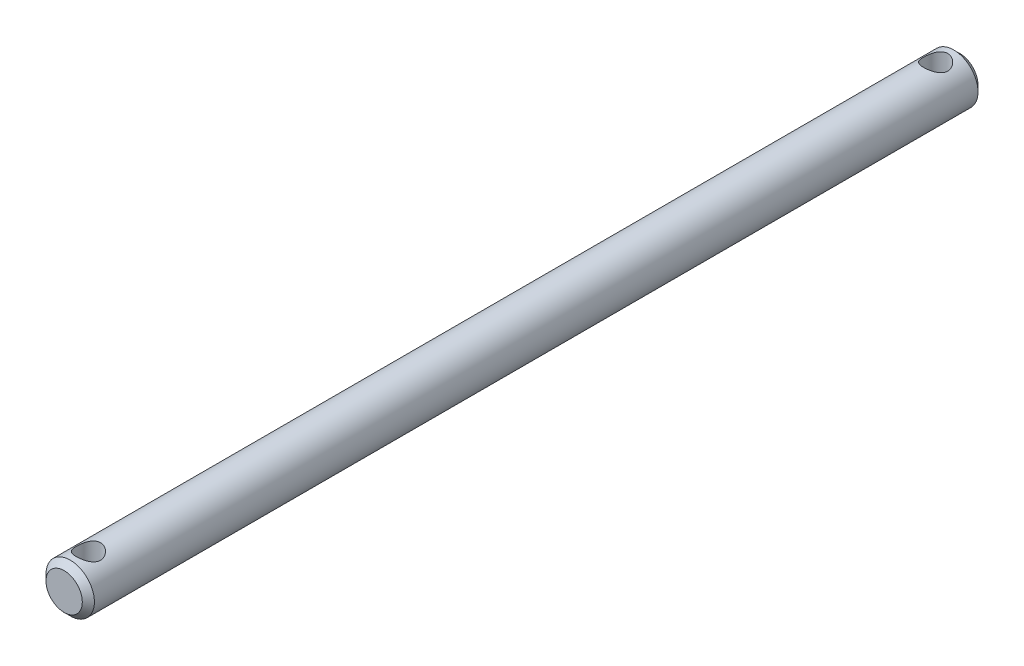
ISO-10303-21;
HEADER;
FILE_DESCRIPTION(('STEP AP214'),'2;1');
FILE_NAME('part.step','',(''),(''),'','','');
FILE_SCHEMA(('AUTOMOTIVE_DESIGN { 1 0 10303 214 1 1 1 1 }'));
ENDSEC;
DATA;
#1=APPLICATION_CONTEXT('core data for automotive mechanical design processes');
#2=APPLICATION_PROTOCOL_DEFINITION('international standard','automotive_design',2000,#1);
#3=PRODUCT_CONTEXT('',#1,'mechanical');
#4=PRODUCT('Part','Part','',(#3));
#5=PRODUCT_RELATED_PRODUCT_CATEGORY('part','',(#4));
#6=PRODUCT_DEFINITION_FORMATION('','',#4);
#7=PRODUCT_DEFINITION_CONTEXT('part definition',#1,'design');
#8=PRODUCT_DEFINITION('design','',#6,#7);
#9=PRODUCT_DEFINITION_SHAPE('','',#8);
#10=(LENGTH_UNIT() NAMED_UNIT(*) SI_UNIT(.MILLI.,.METRE.));
#11=(NAMED_UNIT(*) PLANE_ANGLE_UNIT() SI_UNIT($,.RADIAN.));
#12=(NAMED_UNIT(*) SI_UNIT($,.STERADIAN.) SOLID_ANGLE_UNIT());
#13=UNCERTAINTY_MEASURE_WITH_UNIT(LENGTH_MEASURE(1.E-05),#10,'distance_accuracy_value','');
#14=(GEOMETRIC_REPRESENTATION_CONTEXT(3) GLOBAL_UNCERTAINTY_ASSIGNED_CONTEXT((#13)) GLOBAL_UNIT_ASSIGNED_CONTEXT((#10,
#11,#12)) REPRESENTATION_CONTEXT('',''));
#15=CARTESIAN_POINT('',(0.,0.,0.));
#16=DIRECTION('',(0.,0.,1.));
#17=DIRECTION('',(1.,0.,0.));
#18=AXIS2_PLACEMENT_3D('',#15,#16,#17);
#19=CARTESIAN_POINT('',(0.,0.,74.));
#20=DIRECTION('',(0.,0.,-1.));
#21=DIRECTION('',(-1.,0.,0.));
#22=AXIS2_PLACEMENT_3D('',#19,#20,#21);
#23=CYLINDRICAL_SURFACE('',#22,2.);
#24=CARTESIAN_POINT('',(0.,-2.,3.));
#25=CARTESIAN_POINT('',(0.0525719629529865,-1.99999713404151,2.9999966976805));
#26=CARTESIAN_POINT('',(0.105206599698033,-1.99790491019518,2.99582992687833));
#27=CARTESIAN_POINT('',(0.208920235268425,-1.98974156037396,2.97934711965908));
#28=CARTESIAN_POINT('',(0.259996086713504,-1.98366287828984,2.96701560700235));
#29=CARTESIAN_POINT('',(0.358933544880574,-1.96816279403312,2.93480619138321));
#30=CARTESIAN_POINT('',(0.40680680293918,-1.9587543917752,2.91495761575199));
#31=CARTESIAN_POINT('',(0.498472616806565,-1.93745776515779,2.86842937863506));
#32=CARTESIAN_POINT('',(0.54226549399005,-1.9255697363353,2.84175025575115));
#33=CARTESIAN_POINT('',(0.627507817761919,-1.89956258258057,2.7804827505147));
#34=CARTESIAN_POINT('',(0.668655211122112,-1.88535199127536,2.74551352076036));
#35=CARTESIAN_POINT('',(0.744779444866977,-1.85659970246744,2.66947852075297));
#36=CARTESIAN_POINT('',(0.779751583106766,-1.84205776209035,2.62840814822756));
#37=CARTESIAN_POINT('',(0.845252000450279,-1.81298951197347,2.53751665047662));
#38=CARTESIAN_POINT('',(0.875225335551637,-1.79855186970132,2.48726390165409));
#39=CARTESIAN_POINT('',(0.926168226890695,-1.77285978772321,2.38163266401379));
#40=CARTESIAN_POINT('',(0.947144214966334,-1.7616030760699,2.32625787127725));
#41=CARTESIAN_POINT('',(0.978132442188588,-1.74457867037809,2.21533489457808));
#42=CARTESIAN_POINT('',(0.988725857080441,-1.73852271583714,2.15999554793261));
#43=CARTESIAN_POINT('',(1.00042699330885,-1.73181889948528,2.04802116222052));
#44=CARTESIAN_POINT('',(1.00154408837307,-1.73116569343288,1.99138745912885));
#45=CARTESIAN_POINT('',(0.994687287172294,-1.73510930257248,1.88571397568463));
#46=CARTESIAN_POINT('',(0.987784559536822,-1.73908763662013,1.83657596877695));
#47=CARTESIAN_POINT('',(0.966939849056932,-1.7507622873385,1.74027809062696));
#48=CARTESIAN_POINT('',(0.952995623897652,-1.75845978831776,1.69311885469469));
#49=CARTESIAN_POINT('',(0.918209780386004,-1.77687476412741,1.60077086743434));
#50=CARTESIAN_POINT('',(0.897215067115995,-1.78765840663999,1.55565360121421));
#51=CARTESIAN_POINT('',(0.849041687668002,-1.81103404281404,1.46936570740999));
#52=CARTESIAN_POINT('',(0.821860243812467,-1.82362684780191,1.42819686439991));
#53=CARTESIAN_POINT('',(0.758066054912788,-1.85113157903286,1.34547874725678));
#54=CARTESIAN_POINT('',(0.720694458369282,-1.86613510236746,1.30454312642384));
#55=CARTESIAN_POINT('',(0.639555578741373,-1.89547623300407,1.2292645814091));
#56=CARTESIAN_POINT('',(0.595785256574285,-1.90981351958801,1.19492480796612));
#57=CARTESIAN_POINT('',(0.500516505831848,-1.93701987282964,1.13231433897027));
#58=CARTESIAN_POINT('',(0.448753591599408,-1.94978984162007,1.10439952755426));
#59=CARTESIAN_POINT('',(0.340466215488797,-1.97157881121242,1.05790297095699));
#60=CARTESIAN_POINT('',(0.283945576265276,-1.98060078943553,1.03931381498483));
#61=CARTESIAN_POINT('',(0.172766491660701,-1.99324333741436,1.01352459628333));
#62=CARTESIAN_POINT('',(0.118341530548324,-1.99724938301312,1.00550876425322));
#63=CARTESIAN_POINT('',(0.00877959994935318,-2.00073013459102,0.998535268865512));
#64=CARTESIAN_POINT('',(-0.0463570198699018,-2.00020698721312,0.999573314360523));
#65=CARTESIAN_POINT('',(-0.151232971985994,-1.99491192253441,1.01020668841876));
#66=CARTESIAN_POINT('',(-0.201059408049955,-1.9904724568819,1.01913253273003));
#67=CARTESIAN_POINT('',(-0.298406892301917,-1.97822171314819,1.04423807189509));
#68=CARTESIAN_POINT('',(-0.345927685690997,-1.97041006334332,1.06041856645336));
#69=CARTESIAN_POINT('',(-0.438888608449666,-1.95184251413669,1.09999846643317));
#70=CARTESIAN_POINT('',(-0.484230397006154,-1.94100881769939,1.12359105011681));
#71=CARTESIAN_POINT('',(-0.570461361698921,-1.91743974317109,1.17710753564604));
#72=CARTESIAN_POINT('',(-0.611348629775282,-1.90470355565785,1.20703413459343));
#73=CARTESIAN_POINT('',(-0.691767689290653,-1.87708221337464,1.27576042533288));
#74=CARTESIAN_POINT('',(-0.730772077824639,-1.86210884848441,1.31514286845357));
#75=CARTESIAN_POINT('',(-0.80185632111324,-1.83262391603874,1.39992515126931));
#76=CARTESIAN_POINT('',(-0.833931385690841,-1.81811267381526,1.44532911881638));
#77=CARTESIAN_POINT('',(-0.891707914497696,-1.79051192226068,1.54364365420031));
#78=CARTESIAN_POINT('',(-0.917025495878637,-1.77752529663472,1.5968112662086));
#79=CARTESIAN_POINT('',(-0.958082826013803,-1.75574072368126,1.70751006769252));
#80=CARTESIAN_POINT('',(-0.97383491588757,-1.74693738240618,1.76503552650119));
#81=CARTESIAN_POINT('',(-0.993861687449679,-1.73561501008667,1.87691022286145));
#82=CARTESIAN_POINT('',(-0.999092996400865,-1.73257383460491,1.93103425342904));
#83=CARTESIAN_POINT('',(-1.00068915438079,-1.73165354646175,2.03944706717073));
#84=CARTESIAN_POINT('',(-0.997057846624399,-1.73377219627553,2.09373576873944));
#85=CARTESIAN_POINT('',(-0.981926125592263,-1.74237862050025,2.19548350153202));
#86=CARTESIAN_POINT('',(-0.971208314342799,-1.74843094482394,2.2431004701444));
#87=CARTESIAN_POINT('',(-0.943175358224645,-1.76371016187918,2.33580811942471));
#88=CARTESIAN_POINT('',(-0.92585809115981,-1.77293807569676,2.38089798209197));
#89=CARTESIAN_POINT('',(-0.883815745300683,-1.79428530364528,2.47062485098661));
#90=CARTESIAN_POINT('',(-0.858671137816458,-1.80655722396191,2.5150279018297));
#91=CARTESIAN_POINT('',(-0.802150971636634,-1.8323533163459,2.59927453618059));
#92=CARTESIAN_POINT('',(-0.770772171238648,-1.84587813794522,2.63911573051849));
#93=CARTESIAN_POINT('',(-0.698203326664641,-1.87462323159313,2.71814198235762));
#94=CARTESIAN_POINT('',(-0.656284423010171,-1.88984983311469,2.75665910236192));
#95=CARTESIAN_POINT('',(-0.566154806220279,-1.91877752255088,2.82626298342363));
#96=CARTESIAN_POINT('',(-0.517940723256785,-1.9324777860804,2.85734573942629));
#97=CARTESIAN_POINT('',(-0.415931596819947,-1.95698009585103,2.91123636276221));
#98=CARTESIAN_POINT('',(-0.362099503934614,-1.96776096562909,2.93398416941144));
#99=CARTESIAN_POINT('',(-0.250742101294191,-1.98501341363465,2.96980816791895));
#100=CARTESIAN_POINT('',(-0.193227799623166,-1.99149723372932,2.98291184682958));
#101=CARTESIAN_POINT('',(-0.112601946483384,-1.99695461909663,2.99389741107585));
#102=CARTESIAN_POINT('',(-0.0901618794394985,-1.99809365339202,2.99618264086362));
#103=CARTESIAN_POINT('',(-0.0451517318071576,-1.99961696977865,2.99923466551681));
#104=CARTESIAN_POINT('',(-0.0225816476473814,-2.00000123103763,3.0000014184712));
#105=CARTESIAN_POINT('',(0.,-2.,3.));
#106=B_SPLINE_CURVE_WITH_KNOTS('',3,(#24,#25,#26,#27,#28,#29,#30,#31,#32,#33,#34,#35,#36,#37,
#38,#39,#40,#41,#42,#43,#44,#45,#46,#47,#48,#49,#50,#51,#52,#53,#54,#55,#56,#57,#58,#59,#60,#61,
#62,#63,#64,#65,#66,#67,#68,#69,#70,#71,#72,#73,#74,#75,#76,#77,#78,#79,#80,#81,#82,#83,#84,#85,
#86,#87,#88,#89,#90,#91,#92,#93,#94,#95,#96,#97,#98,#99,#100,#101,#102,#103,#104,#105),
.UNSPECIFIED.,.T.,.F.,(4,2,2,2,2,2,2,2,2,2,2,2,2,2,2,2,2,2,2,2,2,2,2,2,2,2,2,2,2,2,2,2,2,2,2,2,
2,2,2,2,4),(0.,0.157624257420292,0.315548149709198,0.472862155492298,0.630163760581568,
0.796981758718089,0.963926237654035,1.14381726430753,1.32357947898281,1.4925801214023,
1.6614135732902,1.81005712409321,1.95874803925678,2.11090240168487,2.26312521260222,
2.43464941333878,2.60625534598686,2.78583022214441,2.96526216912279,3.12983290471346,
3.29432564511476,3.44606906506122,3.59782921630931,3.75392856027899,3.91009450748339,
4.08159610644419,4.25321588615432,4.43314682159674,4.61284511940778,4.77529307498373,
4.93767059860005,5.08457930244183,5.23153528783678,5.38836456775614,5.54527561138958,
5.72125242752499,5.89732383376573,6.07464013662925,6.2514490862493,6.31915280137698,
6.38685838514847),.UNSPECIFIED.);
#107=CARTESIAN_POINT('',(0.,-2.,3.));
#108=VERTEX_POINT('',#107);
#109=EDGE_CURVE('E10',#108,#108,#106,.T.);
#110=ORIENTED_EDGE('',*,*,#109,.T.);
#111=EDGE_LOOP('',(#110));
#112=FACE_BOUND('',#111,.T.);
#113=CARTESIAN_POINT('',(0.,2.,3.));
#114=CARTESIAN_POINT('',(-0.0525719629529865,1.99999713404151,2.9999966976805));
#115=CARTESIAN_POINT('',(-0.105206599698033,1.99790491019518,2.99582992687833));
#116=CARTESIAN_POINT('',(-0.208920235268425,1.98974156037396,2.97934711965908));
#117=CARTESIAN_POINT('',(-0.259996086713504,1.98366287828984,2.96701560700235));
#118=CARTESIAN_POINT('',(-0.358933544880574,1.96816279403312,2.93480619138321));
#119=CARTESIAN_POINT('',(-0.40680680293918,1.9587543917752,2.91495761575199));
#120=CARTESIAN_POINT('',(-0.498472616806565,1.93745776515779,2.86842937863506));
#121=CARTESIAN_POINT('',(-0.54226549399005,1.9255697363353,2.84175025575115));
#122=CARTESIAN_POINT('',(-0.627507817761919,1.89956258258057,2.7804827505147));
#123=CARTESIAN_POINT('',(-0.668655211122112,1.88535199127536,2.74551352076036));
#124=CARTESIAN_POINT('',(-0.744779444866977,1.85659970246744,2.66947852075297));
#125=CARTESIAN_POINT('',(-0.779751583106766,1.84205776209035,2.62840814822756));
#126=CARTESIAN_POINT('',(-0.845252000450279,1.81298951197347,2.53751665047662));
#127=CARTESIAN_POINT('',(-0.875225335551637,1.79855186970132,2.48726390165409));
#128=CARTESIAN_POINT('',(-0.926168226890695,1.77285978772321,2.38163266401379));
#129=CARTESIAN_POINT('',(-0.947144214966334,1.7616030760699,2.32625787127725));
#130=CARTESIAN_POINT('',(-0.978132442188588,1.74457867037809,2.21533489457808));
#131=CARTESIAN_POINT('',(-0.988725857080441,1.73852271583714,2.15999554793261));
#132=CARTESIAN_POINT('',(-1.00042699330885,1.73181889948528,2.04802116222052));
#133=CARTESIAN_POINT('',(-1.00154408837307,1.73116569343288,1.99138745912885));
#134=CARTESIAN_POINT('',(-0.994687287172294,1.73510930257248,1.88571397568463));
#135=CARTESIAN_POINT('',(-0.987784559536822,1.73908763662013,1.83657596877695));
#136=CARTESIAN_POINT('',(-0.966939849056932,1.7507622873385,1.74027809062696));
#137=CARTESIAN_POINT('',(-0.952995623897652,1.75845978831776,1.69311885469469));
#138=CARTESIAN_POINT('',(-0.918209780386004,1.77687476412741,1.60077086743434));
#139=CARTESIAN_POINT('',(-0.897215067115995,1.78765840663999,1.55565360121421));
#140=CARTESIAN_POINT('',(-0.849041687668002,1.81103404281404,1.46936570740999));
#141=CARTESIAN_POINT('',(-0.821860243812467,1.82362684780191,1.42819686439991));
#142=CARTESIAN_POINT('',(-0.758066054912788,1.85113157903286,1.34547874725678));
#143=CARTESIAN_POINT('',(-0.720694458369282,1.86613510236746,1.30454312642384));
#144=CARTESIAN_POINT('',(-0.639555578741373,1.89547623300407,1.2292645814091));
#145=CARTESIAN_POINT('',(-0.595785256574285,1.90981351958801,1.19492480796612));
#146=CARTESIAN_POINT('',(-0.500516505831848,1.93701987282964,1.13231433897027));
#147=CARTESIAN_POINT('',(-0.448753591599408,1.94978984162007,1.10439952755426));
#148=CARTESIAN_POINT('',(-0.340466215488797,1.97157881121242,1.05790297095699));
#149=CARTESIAN_POINT('',(-0.283945576265276,1.98060078943553,1.03931381498483));
#150=CARTESIAN_POINT('',(-0.172766491660701,1.99324333741436,1.01352459628333));
#151=CARTESIAN_POINT('',(-0.118341530548324,1.99724938301312,1.00550876425322));
#152=CARTESIAN_POINT('',(-0.00877959994935318,2.00073013459102,0.998535268865512));
#153=CARTESIAN_POINT('',(0.0463570198699018,2.00020698721312,0.999573314360523));
#154=CARTESIAN_POINT('',(0.151232971985994,1.99491192253441,1.01020668841876));
#155=CARTESIAN_POINT('',(0.201059408049955,1.9904724568819,1.01913253273003));
#156=CARTESIAN_POINT('',(0.298406892301917,1.97822171314819,1.04423807189509));
#157=CARTESIAN_POINT('',(0.345927685690997,1.97041006334332,1.06041856645336));
#158=CARTESIAN_POINT('',(0.438888608449666,1.95184251413669,1.09999846643317));
#159=CARTESIAN_POINT('',(0.484230397006154,1.94100881769939,1.12359105011681));
#160=CARTESIAN_POINT('',(0.570461361698921,1.91743974317109,1.17710753564604));
#161=CARTESIAN_POINT('',(0.611348629775282,1.90470355565785,1.20703413459343));
#162=CARTESIAN_POINT('',(0.691767689290653,1.87708221337464,1.27576042533288));
#163=CARTESIAN_POINT('',(0.730772077824639,1.86210884848441,1.31514286845357));
#164=CARTESIAN_POINT('',(0.80185632111324,1.83262391603874,1.39992515126931));
#165=CARTESIAN_POINT('',(0.833931385690841,1.81811267381526,1.44532911881638));
#166=CARTESIAN_POINT('',(0.891707914497696,1.79051192226068,1.54364365420031));
#167=CARTESIAN_POINT('',(0.917025495878637,1.77752529663472,1.5968112662086));
#168=CARTESIAN_POINT('',(0.958082826013803,1.75574072368126,1.70751006769252));
#169=CARTESIAN_POINT('',(0.97383491588757,1.74693738240618,1.76503552650119));
#170=CARTESIAN_POINT('',(0.993861687449679,1.73561501008667,1.87691022286145));
#171=CARTESIAN_POINT('',(0.999092996400865,1.73257383460491,1.93103425342904));
#172=CARTESIAN_POINT('',(1.00068915438079,1.73165354646175,2.03944706717073));
#173=CARTESIAN_POINT('',(0.997057846624399,1.73377219627553,2.09373576873944));
#174=CARTESIAN_POINT('',(0.981926125592263,1.74237862050025,2.19548350153202));
#175=CARTESIAN_POINT('',(0.971208314342799,1.74843094482394,2.2431004701444));
#176=CARTESIAN_POINT('',(0.943175358224645,1.76371016187918,2.33580811942471));
#177=CARTESIAN_POINT('',(0.92585809115981,1.77293807569676,2.38089798209197));
#178=CARTESIAN_POINT('',(0.883815745300683,1.79428530364528,2.47062485098661));
#179=CARTESIAN_POINT('',(0.858671137816458,1.80655722396191,2.5150279018297));
#180=CARTESIAN_POINT('',(0.802150971636634,1.8323533163459,2.59927453618059));
#181=CARTESIAN_POINT('',(0.770772171238648,1.84587813794522,2.63911573051849));
#182=CARTESIAN_POINT('',(0.698203326664641,1.87462323159313,2.71814198235762));
#183=CARTESIAN_POINT('',(0.656284423010171,1.88984983311469,2.75665910236192));
#184=CARTESIAN_POINT('',(0.566154806220279,1.91877752255088,2.82626298342363));
#185=CARTESIAN_POINT('',(0.517940723256785,1.9324777860804,2.85734573942629));
#186=CARTESIAN_POINT('',(0.415931596819947,1.95698009585103,2.91123636276221));
#187=CARTESIAN_POINT('',(0.362099503934614,1.96776096562909,2.93398416941144));
#188=CARTESIAN_POINT('',(0.250742101294191,1.98501341363465,2.96980816791895));
#189=CARTESIAN_POINT('',(0.193227799623166,1.99149723372932,2.98291184682958));
#190=CARTESIAN_POINT('',(0.112601946483384,1.99695461909663,2.99389741107585));
#191=CARTESIAN_POINT('',(0.0901618794394985,1.99809365339202,2.99618264086362));
#192=CARTESIAN_POINT('',(0.0451517318071576,1.99961696977865,2.99923466551681));
#193=CARTESIAN_POINT('',(0.0225816476473814,2.00000123103763,3.0000014184712));
#194=CARTESIAN_POINT('',(0.,2.,3.));
#195=B_SPLINE_CURVE_WITH_KNOTS('',3,(#113,#114,#115,#116,#117,#118,#119,#120,#121,#122,#123,
#124,#125,#126,#127,#128,#129,#130,#131,#132,#133,#134,#135,#136,#137,#138,#139,#140,#141,#142,
#143,#144,#145,#146,#147,#148,#149,#150,#151,#152,#153,#154,#155,#156,#157,#158,#159,#160,#161,
#162,#163,#164,#165,#166,#167,#168,#169,#170,#171,#172,#173,#174,#175,#176,#177,#178,#179,#180,
#181,#182,#183,#184,#185,#186,#187,#188,#189,#190,#191,#192,#193,#194),.UNSPECIFIED.,.T.,.F.,(4,
2,2,2,2,2,2,2,2,2,2,2,2,2,2,2,2,2,2,2,2,2,2,2,2,2,2,2,2,2,2,2,2,2,2,2,2,2,2,2,4),(0.,
0.157624257420292,0.315548149709198,0.472862155492298,0.630163760581568,0.796981758718089,
0.963926237654035,1.14381726430753,1.32357947898281,1.4925801214023,1.6614135732902,
1.81005712409321,1.95874803925678,2.11090240168487,2.26312521260222,2.43464941333878,
2.60625534598686,2.78583022214441,2.96526216912279,3.12983290471346,3.29432564511476,
3.44606906506122,3.59782921630931,3.75392856027899,3.91009450748339,4.08159610644419,
4.25321588615432,4.43314682159674,4.61284511940778,4.77529307498373,4.93767059860005,
5.08457930244183,5.23153528783678,5.38836456775614,5.54527561138958,5.72125242752499,
5.89732383376573,6.07464013662925,6.2514490862493,6.31915280137698,6.38685838514847),.UNSPECIFIED.);
#196=CARTESIAN_POINT('',(0.,2.,3.));
#197=VERTEX_POINT('',#196);
#198=EDGE_CURVE('E41',#197,#197,#195,.T.);
#199=ORIENTED_EDGE('',*,*,#198,.T.);
#200=EDGE_LOOP('',(#199));
#201=FACE_BOUND('',#200,.T.);
#202=CARTESIAN_POINT('',(0.,-2.,73.));
#203=CARTESIAN_POINT('',(0.0525719629529861,-1.99999713404151,72.9999966976805));
#204=CARTESIAN_POINT('',(0.105206599698031,-1.99790491019518,72.9958299268783));
#205=CARTESIAN_POINT('',(0.208920235268424,-1.98974156037396,72.9793471196591));
#206=CARTESIAN_POINT('',(0.259996086713503,-1.98366287828984,72.9670156070024));
#207=CARTESIAN_POINT('',(0.358933544880573,-1.96816279403312,72.9348061913832));
#208=CARTESIAN_POINT('',(0.406806802939178,-1.9587543917752,72.914957615752));
#209=CARTESIAN_POINT('',(0.498472616806562,-1.93745776515779,72.8684293786351));
#210=CARTESIAN_POINT('',(0.542265493990046,-1.9255697363353,72.8417502557512));
#211=CARTESIAN_POINT('',(0.627507817761916,-1.89956258258057,72.7804827505147));
#212=CARTESIAN_POINT('',(0.668655211122111,-1.88535199127536,72.7455135207604));
#213=CARTESIAN_POINT('',(0.744779444866977,-1.85659970246744,72.669478520753));
#214=CARTESIAN_POINT('',(0.779751583106765,-1.84205776209035,72.6284081482276));
#215=CARTESIAN_POINT('',(0.845252000450278,-1.81298951197347,72.5375166504766));
#216=CARTESIAN_POINT('',(0.87522533555164,-1.79855186970132,72.4872639016541));
#217=CARTESIAN_POINT('',(0.926168226890697,-1.77285978772321,72.3816326640138));
#218=CARTESIAN_POINT('',(0.947144214966333,-1.7616030760699,72.3262578712773));
#219=CARTESIAN_POINT('',(0.978132442188589,-1.74457867037808,72.2153348945781));
#220=CARTESIAN_POINT('',(0.988725857080442,-1.73852271583713,72.1599955479326));
#221=CARTESIAN_POINT('',(1.00042699330885,-1.73181889948528,72.0480211622205));
#222=CARTESIAN_POINT('',(1.00154408837307,-1.73116569343288,71.9913874591288));
#223=CARTESIAN_POINT('',(0.994687287172295,-1.73510930257248,71.8857139756847));
#224=CARTESIAN_POINT('',(0.987784559536821,-1.73908763662014,71.836575968777));
#225=CARTESIAN_POINT('',(0.966939849056934,-1.7507622873385,71.740278090627));
#226=CARTESIAN_POINT('',(0.952995623897655,-1.75845978831776,71.6931188546947));
#227=CARTESIAN_POINT('',(0.918209780386007,-1.77687476412741,71.6007708674343));
#228=CARTESIAN_POINT('',(0.897215067115998,-1.78765840663998,71.5556536012142));
#229=CARTESIAN_POINT('',(0.849041687668004,-1.81103404281404,71.46936570741));
#230=CARTESIAN_POINT('',(0.821860243812469,-1.82362684780191,71.4281968643999));
#231=CARTESIAN_POINT('',(0.758066054912791,-1.85113157903286,71.3454787472568));
#232=CARTESIAN_POINT('',(0.720694458369287,-1.86613510236746,71.3045431264239));
#233=CARTESIAN_POINT('',(0.63955557874138,-1.89547623300407,71.2292645814091));
#234=CARTESIAN_POINT('',(0.595785256574291,-1.90981351958801,71.1949248079661));
#235=CARTESIAN_POINT('',(0.50051650583185,-1.93701987282964,71.1323143389703));
#236=CARTESIAN_POINT('',(0.448753591599408,-1.94978984162007,71.1043995275543));
#237=CARTESIAN_POINT('',(0.340466215488795,-1.97157881121242,71.057902970957));
#238=CARTESIAN_POINT('',(0.283945576265275,-1.98060078943553,71.0393138149848));
#239=CARTESIAN_POINT('',(0.172766491660701,-1.99324333741436,71.0135245962833));
#240=CARTESIAN_POINT('',(0.118341530548324,-1.99724938301312,71.0055087642532));
#241=CARTESIAN_POINT('',(0.00877959994935508,-2.00073013459102,70.9985352688655));
#242=CARTESIAN_POINT('',(-0.0463570198698992,-2.00020698721312,70.9995733143605));
#243=CARTESIAN_POINT('',(-0.151232971985989,-1.99491192253441,71.0102066884188));
#244=CARTESIAN_POINT('',(-0.201059408049948,-1.9904724568819,71.01913253273));
#245=CARTESIAN_POINT('',(-0.298406892301911,-1.97822171314819,71.0442380718951));
#246=CARTESIAN_POINT('',(-0.345927685690993,-1.97041006334333,71.0604185664534));
#247=CARTESIAN_POINT('',(-0.438888608449664,-1.9518425141367,71.0999984664332));
#248=CARTESIAN_POINT('',(-0.484230397006153,-1.94100881769939,71.1235910501168));
#249=CARTESIAN_POINT('',(-0.57046136169892,-1.91743974317109,71.177107535646));
#250=CARTESIAN_POINT('',(-0.61134862977528,-1.90470355565785,71.2070341345934));
#251=CARTESIAN_POINT('',(-0.691767689290652,-1.87708221337464,71.2757604253329));
#252=CARTESIAN_POINT('',(-0.730772077824639,-1.86210884848441,71.3151428684536));
#253=CARTESIAN_POINT('',(-0.801856321113242,-1.83262391603874,71.3999251512693));
#254=CARTESIAN_POINT('',(-0.833931385690843,-1.81811267381526,71.4453291188164));
#255=CARTESIAN_POINT('',(-0.891707914497694,-1.79051192226068,71.5436436542003));
#256=CARTESIAN_POINT('',(-0.917025495878633,-1.77752529663472,71.5968112662086));
#257=CARTESIAN_POINT('',(-0.958082826013798,-1.75574072368126,71.7075100676925));
#258=CARTESIAN_POINT('',(-0.973834915887566,-1.74693738240618,71.7650355265012));
#259=CARTESIAN_POINT('',(-0.993861687449677,-1.73561501008667,71.8769102228614));
#260=CARTESIAN_POINT('',(-0.999092996400864,-1.73257383460491,71.931034253429));
#261=CARTESIAN_POINT('',(-1.00068915438079,-1.73165354646175,72.0394470671707));
#262=CARTESIAN_POINT('',(-0.9970578466244,-1.73377219627553,72.0937357687394));
#263=CARTESIAN_POINT('',(-0.981926125592264,-1.74237862050025,72.195483501532));
#264=CARTESIAN_POINT('',(-0.971208314342801,-1.74843094482394,72.2431004701444));
#265=CARTESIAN_POINT('',(-0.943175358224646,-1.76371016187917,72.3358081194247));
#266=CARTESIAN_POINT('',(-0.925858091159809,-1.77293807569676,72.380897982092));
#267=CARTESIAN_POINT('',(-0.883815745300685,-1.79428530364528,72.4706248509866));
#268=CARTESIAN_POINT('',(-0.858671137816466,-1.8065572239619,72.5150279018297));
#269=CARTESIAN_POINT('',(-0.802150971636646,-1.8323533163459,72.5992745361806));
#270=CARTESIAN_POINT('',(-0.770772171238655,-1.84587813794522,72.6391157305185));
#271=CARTESIAN_POINT('',(-0.698203326664646,-1.87462323159313,72.7181419823576));
#272=CARTESIAN_POINT('',(-0.656284423010179,-1.88984983311468,72.7566591023619));
#273=CARTESIAN_POINT('',(-0.566154806220288,-1.91877752255087,72.8262629834236));
#274=CARTESIAN_POINT('',(-0.517940723256792,-1.9324777860804,72.8573457394263));
#275=CARTESIAN_POINT('',(-0.415931596819954,-1.95698009585103,72.9112363627622));
#276=CARTESIAN_POINT('',(-0.362099503934623,-1.96776096562909,72.9339841694114));
#277=CARTESIAN_POINT('',(-0.250742101294199,-1.98501341363465,72.969808167919));
#278=CARTESIAN_POINT('',(-0.193227799623171,-1.99149723372932,72.9829118468296));
#279=CARTESIAN_POINT('',(-0.112601946483386,-1.99695461909663,72.9938974110758));
#280=CARTESIAN_POINT('',(-0.0901618794395005,-1.99809365339201,72.9961826408636));
#281=CARTESIAN_POINT('',(-0.0451517318071585,-1.99961696977865,72.9992346655168));
#282=CARTESIAN_POINT('',(-0.0225816476473818,-2.00000123103763,73.0000014184712));
#283=CARTESIAN_POINT('',(0.,-2.,73.));
#284=B_SPLINE_CURVE_WITH_KNOTS('',3,(#202,#203,#204,#205,#206,#207,#208,#209,#210,#211,#212,
#213,#214,#215,#216,#217,#218,#219,#220,#221,#222,#223,#224,#225,#226,#227,#228,#229,#230,#231,
#232,#233,#234,#235,#236,#237,#238,#239,#240,#241,#242,#243,#244,#245,#246,#247,#248,#249,#250,
#251,#252,#253,#254,#255,#256,#257,#258,#259,#260,#261,#262,#263,#264,#265,#266,#267,#268,#269,
#270,#271,#272,#273,#274,#275,#276,#277,#278,#279,#280,#281,#282,#283),.UNSPECIFIED.,.T.,.F.,(4,
2,2,2,2,2,2,2,2,2,2,2,2,2,2,2,2,2,2,2,2,2,2,2,2,2,2,2,2,2,2,2,2,2,2,2,2,2,2,2,4),(0.,
0.157624257420292,0.315548149709195,0.472862155492291,0.630163760581568,0.796981758718083,
0.963926237654041,1.14381726430754,1.3235794789828,1.4925801214023,1.6614135732902,
1.8100571240932,1.95874803925679,2.11090240168486,2.26312521260222,2.43464941333877,
2.60625534598686,2.78583022214441,2.9652621691228,3.12983290471346,3.29432564511476,
3.44606906506122,3.59782921630931,3.75392856027898,3.91009450748339,4.08159610644419,
4.25321588615432,4.43314682159673,4.61284511940776,4.77529307498372,4.93767059860005,
5.08457930244182,5.23153528783679,5.38836456775612,5.54527561138957,5.72125242752498,
5.89732383376572,6.07464013662924,6.2514490862493,6.31915280137698,6.38685838514847),.UNSPECIFIED.);
#285=CARTESIAN_POINT('',(0.,-2.,73.));
#286=VERTEX_POINT('',#285);
#287=EDGE_CURVE('E45',#286,#286,#284,.T.);
#288=ORIENTED_EDGE('',*,*,#287,.T.);
#289=EDGE_LOOP('',(#288));
#290=FACE_BOUND('',#289,.T.);
#291=CARTESIAN_POINT('',(0.,2.,73.));
#292=CARTESIAN_POINT('',(-0.0525719629529861,1.99999713404151,72.9999966976805));
#293=CARTESIAN_POINT('',(-0.105206599698031,1.99790491019518,72.9958299268783));
#294=CARTESIAN_POINT('',(-0.208920235268424,1.98974156037396,72.9793471196591));
#295=CARTESIAN_POINT('',(-0.259996086713503,1.98366287828984,72.9670156070024));
#296=CARTESIAN_POINT('',(-0.358933544880573,1.96816279403312,72.9348061913832));
#297=CARTESIAN_POINT('',(-0.406806802939178,1.9587543917752,72.914957615752));
#298=CARTESIAN_POINT('',(-0.498472616806562,1.93745776515779,72.8684293786351));
#299=CARTESIAN_POINT('',(-0.542265493990046,1.9255697363353,72.8417502557512));
#300=CARTESIAN_POINT('',(-0.627507817761916,1.89956258258057,72.7804827505147));
#301=CARTESIAN_POINT('',(-0.668655211122111,1.88535199127536,72.7455135207604));
#302=CARTESIAN_POINT('',(-0.744779444866977,1.85659970246744,72.669478520753));
#303=CARTESIAN_POINT('',(-0.779751583106765,1.84205776209035,72.6284081482276));
#304=CARTESIAN_POINT('',(-0.845252000450278,1.81298951197347,72.5375166504766));
#305=CARTESIAN_POINT('',(-0.87522533555164,1.79855186970132,72.4872639016541));
#306=CARTESIAN_POINT('',(-0.926168226890697,1.77285978772321,72.3816326640138));
#307=CARTESIAN_POINT('',(-0.947144214966333,1.7616030760699,72.3262578712773));
#308=CARTESIAN_POINT('',(-0.978132442188589,1.74457867037808,72.2153348945781));
#309=CARTESIAN_POINT('',(-0.988725857080442,1.73852271583713,72.1599955479326));
#310=CARTESIAN_POINT('',(-1.00042699330885,1.73181889948528,72.0480211622205));
#311=CARTESIAN_POINT('',(-1.00154408837307,1.73116569343288,71.9913874591288));
#312=CARTESIAN_POINT('',(-0.994687287172295,1.73510930257248,71.8857139756847));
#313=CARTESIAN_POINT('',(-0.987784559536821,1.73908763662014,71.836575968777));
#314=CARTESIAN_POINT('',(-0.966939849056934,1.7507622873385,71.740278090627));
#315=CARTESIAN_POINT('',(-0.952995623897655,1.75845978831776,71.6931188546947));
#316=CARTESIAN_POINT('',(-0.918209780386007,1.77687476412741,71.6007708674343));
#317=CARTESIAN_POINT('',(-0.897215067115998,1.78765840663998,71.5556536012142));
#318=CARTESIAN_POINT('',(-0.849041687668004,1.81103404281404,71.46936570741));
#319=CARTESIAN_POINT('',(-0.821860243812469,1.82362684780191,71.4281968643999));
#320=CARTESIAN_POINT('',(-0.758066054912791,1.85113157903286,71.3454787472568));
#321=CARTESIAN_POINT('',(-0.720694458369287,1.86613510236746,71.3045431264239));
#322=CARTESIAN_POINT('',(-0.63955557874138,1.89547623300407,71.2292645814091));
#323=CARTESIAN_POINT('',(-0.595785256574291,1.90981351958801,71.1949248079661));
#324=CARTESIAN_POINT('',(-0.50051650583185,1.93701987282964,71.1323143389703));
#325=CARTESIAN_POINT('',(-0.448753591599408,1.94978984162007,71.1043995275543));
#326=CARTESIAN_POINT('',(-0.340466215488795,1.97157881121242,71.057902970957));
#327=CARTESIAN_POINT('',(-0.283945576265275,1.98060078943553,71.0393138149848));
#328=CARTESIAN_POINT('',(-0.172766491660701,1.99324333741436,71.0135245962833));
#329=CARTESIAN_POINT('',(-0.118341530548324,1.99724938301312,71.0055087642532));
#330=CARTESIAN_POINT('',(-0.00877959994935508,2.00073013459102,70.9985352688655));
#331=CARTESIAN_POINT('',(0.0463570198698992,2.00020698721312,70.9995733143605));
#332=CARTESIAN_POINT('',(0.151232971985989,1.99491192253441,71.0102066884188));
#333=CARTESIAN_POINT('',(0.201059408049948,1.9904724568819,71.01913253273));
#334=CARTESIAN_POINT('',(0.298406892301911,1.97822171314819,71.0442380718951));
#335=CARTESIAN_POINT('',(0.345927685690993,1.97041006334333,71.0604185664534));
#336=CARTESIAN_POINT('',(0.438888608449664,1.9518425141367,71.0999984664332));
#337=CARTESIAN_POINT('',(0.484230397006153,1.94100881769939,71.1235910501168));
#338=CARTESIAN_POINT('',(0.57046136169892,1.91743974317109,71.177107535646));
#339=CARTESIAN_POINT('',(0.61134862977528,1.90470355565785,71.2070341345934));
#340=CARTESIAN_POINT('',(0.691767689290652,1.87708221337464,71.2757604253329));
#341=CARTESIAN_POINT('',(0.730772077824639,1.86210884848441,71.3151428684536));
#342=CARTESIAN_POINT('',(0.801856321113242,1.83262391603874,71.3999251512693));
#343=CARTESIAN_POINT('',(0.833931385690843,1.81811267381526,71.4453291188164));
#344=CARTESIAN_POINT('',(0.891707914497694,1.79051192226068,71.5436436542003));
#345=CARTESIAN_POINT('',(0.917025495878633,1.77752529663472,71.5968112662086));
#346=CARTESIAN_POINT('',(0.958082826013798,1.75574072368126,71.7075100676925));
#347=CARTESIAN_POINT('',(0.973834915887566,1.74693738240618,71.7650355265012));
#348=CARTESIAN_POINT('',(0.993861687449677,1.73561501008667,71.8769102228614));
#349=CARTESIAN_POINT('',(0.999092996400864,1.73257383460491,71.931034253429));
#350=CARTESIAN_POINT('',(1.00068915438079,1.73165354646175,72.0394470671707));
#351=CARTESIAN_POINT('',(0.9970578466244,1.73377219627553,72.0937357687394));
#352=CARTESIAN_POINT('',(0.981926125592264,1.74237862050025,72.195483501532));
#353=CARTESIAN_POINT('',(0.971208314342801,1.74843094482394,72.2431004701444));
#354=CARTESIAN_POINT('',(0.943175358224646,1.76371016187917,72.3358081194247));
#355=CARTESIAN_POINT('',(0.925858091159809,1.77293807569676,72.380897982092));
#356=CARTESIAN_POINT('',(0.883815745300685,1.79428530364528,72.4706248509866));
#357=CARTESIAN_POINT('',(0.858671137816466,1.8065572239619,72.5150279018297));
#358=CARTESIAN_POINT('',(0.802150971636646,1.8323533163459,72.5992745361806));
#359=CARTESIAN_POINT('',(0.770772171238655,1.84587813794522,72.6391157305185));
#360=CARTESIAN_POINT('',(0.698203326664646,1.87462323159313,72.7181419823576));
#361=CARTESIAN_POINT('',(0.656284423010179,1.88984983311468,72.7566591023619));
#362=CARTESIAN_POINT('',(0.566154806220288,1.91877752255087,72.8262629834236));
#363=CARTESIAN_POINT('',(0.517940723256792,1.9324777860804,72.8573457394263));
#364=CARTESIAN_POINT('',(0.415931596819954,1.95698009585103,72.9112363627622));
#365=CARTESIAN_POINT('',(0.362099503934623,1.96776096562909,72.9339841694114));
#366=CARTESIAN_POINT('',(0.250742101294199,1.98501341363465,72.969808167919));
#367=CARTESIAN_POINT('',(0.193227799623171,1.99149723372932,72.9829118468296));
#368=CARTESIAN_POINT('',(0.112601946483386,1.99695461909663,72.9938974110758));
#369=CARTESIAN_POINT('',(0.0901618794395005,1.99809365339201,72.9961826408636));
#370=CARTESIAN_POINT('',(0.0451517318071585,1.99961696977865,72.9992346655168));
#371=CARTESIAN_POINT('',(0.0225816476473818,2.00000123103763,73.0000014184712));
#372=CARTESIAN_POINT('',(0.,2.,73.));
#373=B_SPLINE_CURVE_WITH_KNOTS('',3,(#291,#292,#293,#294,#295,#296,#297,#298,#299,#300,#301,
#302,#303,#304,#305,#306,#307,#308,#309,#310,#311,#312,#313,#314,#315,#316,#317,#318,#319,#320,
#321,#322,#323,#324,#325,#326,#327,#328,#329,#330,#331,#332,#333,#334,#335,#336,#337,#338,#339,
#340,#341,#342,#343,#344,#345,#346,#347,#348,#349,#350,#351,#352,#353,#354,#355,#356,#357,#358,
#359,#360,#361,#362,#363,#364,#365,#366,#367,#368,#369,#370,#371,#372),.UNSPECIFIED.,.T.,.F.,(4,
2,2,2,2,2,2,2,2,2,2,2,2,2,2,2,2,2,2,2,2,2,2,2,2,2,2,2,2,2,2,2,2,2,2,2,2,2,2,2,4),(0.,
0.157624257420292,0.315548149709195,0.472862155492291,0.630163760581568,0.796981758718083,
0.963926237654041,1.14381726430754,1.3235794789828,1.4925801214023,1.6614135732902,
1.8100571240932,1.95874803925679,2.11090240168486,2.26312521260222,2.43464941333877,
2.60625534598686,2.78583022214441,2.9652621691228,3.12983290471346,3.29432564511476,
3.44606906506122,3.59782921630931,3.75392856027898,3.91009450748339,4.08159610644419,
4.25321588615432,4.43314682159673,4.61284511940776,4.77529307498372,4.93767059860005,
5.08457930244182,5.23153528783679,5.38836456775612,5.54527561138957,5.72125242752498,
5.89732383376572,6.07464013662924,6.2514490862493,6.31915280137698,6.38685838514847),.UNSPECIFIED.);
#374=CARTESIAN_POINT('',(0.,2.,73.));
#375=VERTEX_POINT('',#374);
#376=EDGE_CURVE('E49',#375,#375,#373,.T.);
#377=ORIENTED_EDGE('',*,*,#376,.T.);
#378=EDGE_LOOP('',(#377));
#379=FACE_BOUND('',#378,.T.);
#380=CARTESIAN_POINT('',(0.,0.,0.5));
#381=DIRECTION('',(0.,0.,1.));
#382=DIRECTION('',(1.,0.,0.));
#383=AXIS2_PLACEMENT_3D('',#380,#381,#382);
#384=CIRCLE('',#383,2.);
#385=CARTESIAN_POINT('',(2.,0.,0.5));
#386=VERTEX_POINT('',#385);
#387=EDGE_CURVE('E81',#386,#386,#384,.T.);
#388=ORIENTED_EDGE('',*,*,#387,.T.);
#389=EDGE_LOOP('',(#388));
#390=FACE_BOUND('',#389,.T.);
#391=CARTESIAN_POINT('',(0.,0.,73.5));
#392=DIRECTION('',(0.,0.,1.));
#393=DIRECTION('',(1.,0.,0.));
#394=AXIS2_PLACEMENT_3D('',#391,#392,#393);
#395=CIRCLE('',#394,2.);
#396=CARTESIAN_POINT('',(2.,0.,73.5));
#397=VERTEX_POINT('',#396);
#398=EDGE_CURVE('E84',#397,#397,#395,.F.);
#399=ORIENTED_EDGE('',*,*,#398,.T.);
#400=EDGE_LOOP('',(#399));
#401=FACE_BOUND('',#400,.T.);
#402=ADVANCED_FACE('F30',(#112,#201,#290,#379,#390,#401),#23,.T.);
#403=CARTESIAN_POINT('',(0.,0.,74.));
#404=DIRECTION('',(0.,0.,1.));
#405=DIRECTION('',(1.,0.,0.));
#406=AXIS2_PLACEMENT_3D('',#403,#404,#405);
#407=PLANE('',#406);
#408=CARTESIAN_POINT('',(0.,0.,74.));
#409=DIRECTION('',(0.,0.,1.));
#410=DIRECTION('',(1.,0.,0.));
#411=AXIS2_PLACEMENT_3D('',#408,#409,#410);
#412=CIRCLE('',#411,1.5);
#413=CARTESIAN_POINT('',(1.5,0.,74.));
#414=VERTEX_POINT('',#413);
#415=EDGE_CURVE('E75',#414,#414,#412,.T.);
#416=ORIENTED_EDGE('',*,*,#415,.T.);
#417=EDGE_LOOP('',(#416));
#418=FACE_BOUND('',#417,.T.);
#419=ADVANCED_FACE('F69',(#418),#407,.T.);
#420=CARTESIAN_POINT('',(0.,0.,0.));
#421=DIRECTION('',(0.,0.,1.));
#422=DIRECTION('',(1.,0.,0.));
#423=AXIS2_PLACEMENT_3D('',#420,#421,#422);
#424=PLANE('',#423);
#425=CARTESIAN_POINT('',(0.,0.,0.));
#426=DIRECTION('',(0.,0.,1.));
#427=DIRECTION('',(1.,0.,0.));
#428=AXIS2_PLACEMENT_3D('',#425,#426,#427);
#429=CIRCLE('',#428,1.49999999999999);
#430=CARTESIAN_POINT('',(1.49999999999999,0.,0.));
#431=VERTEX_POINT('',#430);
#432=EDGE_CURVE('E78',#431,#431,#429,.F.);
#433=ORIENTED_EDGE('',*,*,#432,.T.);
#434=EDGE_LOOP('',(#433));
#435=FACE_BOUND('',#434,.T.);
#436=ADVANCED_FACE('F95',(#435),#424,.F.);
#437=CARTESIAN_POINT('',(0.,0.,0.5));
#438=DIRECTION('',(0.,0.,1.));
#439=DIRECTION('',(1.,0.,0.));
#440=AXIS2_PLACEMENT_3D('',#437,#438,#439);
#441=CONICAL_SURFACE('',#440,2.,0.785398163397454);
#442=ORIENTED_EDGE('',*,*,#432,.F.);
#443=EDGE_LOOP('',(#442));
#444=FACE_BOUND('',#443,.T.);
#445=ORIENTED_EDGE('',*,*,#387,.F.);
#446=EDGE_LOOP('',(#445));
#447=FACE_BOUND('',#446,.T.);
#448=ADVANCED_FACE('F91',(#444,#447),#441,.T.);
#449=CARTESIAN_POINT('',(0.,0.,74.));
#450=DIRECTION('',(0.,0.,-1.));
#451=DIRECTION('',(-1.,0.,0.));
#452=AXIS2_PLACEMENT_3D('',#449,#450,#451);
#453=CONICAL_SURFACE('',#452,1.5,0.78539816339746);
#454=ORIENTED_EDGE('',*,*,#398,.F.);
#455=EDGE_LOOP('',(#454));
#456=FACE_BOUND('',#455,.T.);
#457=ORIENTED_EDGE('',*,*,#415,.F.);
#458=EDGE_LOOP('',(#457));
#459=FACE_BOUND('',#458,.T.);
#460=ADVANCED_FACE('F32',(#456,#459),#453,.T.);
#461=CARTESIAN_POINT('',(0.,-2.,72.));
#462=DIRECTION('',(0.,1.,0.));
#463=DIRECTION('',(0.,0.,1.));
#464=AXIS2_PLACEMENT_3D('',#461,#462,#463);
#465=CYLINDRICAL_SURFACE('',#464,1.);
#466=ORIENTED_EDGE('',*,*,#376,.F.);
#467=EDGE_LOOP('',(#466));
#468=FACE_BOUND('',#467,.T.);
#469=ORIENTED_EDGE('',*,*,#287,.F.);
#470=EDGE_LOOP('',(#469));
#471=FACE_BOUND('',#470,.T.);
#472=ADVANCED_FACE('F62',(#468,#471),#465,.F.);
#473=CARTESIAN_POINT('',(0.,-2.,2.));
#474=DIRECTION('',(0.,1.,0.));
#475=DIRECTION('',(0.,0.,1.));
#476=AXIS2_PLACEMENT_3D('',#473,#474,#475);
#477=CYLINDRICAL_SURFACE('',#476,1.);
#478=ORIENTED_EDGE('',*,*,#198,.F.);
#479=EDGE_LOOP('',(#478));
#480=FACE_BOUND('',#479,.T.);
#481=ORIENTED_EDGE('',*,*,#109,.F.);
#482=EDGE_LOOP('',(#481));
#483=FACE_BOUND('',#482,.T.);
#484=ADVANCED_FACE('F59',(#480,#483),#477,.F.);
#485=CLOSED_SHELL('',(#402,#419,#436,#448,#460,#472,#484));
#486=MANIFOLD_SOLID_BREP('B2',#485);
#487=ADVANCED_BREP_SHAPE_REPRESENTATION('',(#18,#486),#14);
#488=SHAPE_DEFINITION_REPRESENTATION(#9,#487);
ENDSEC;
END-ISO-10303-21;
